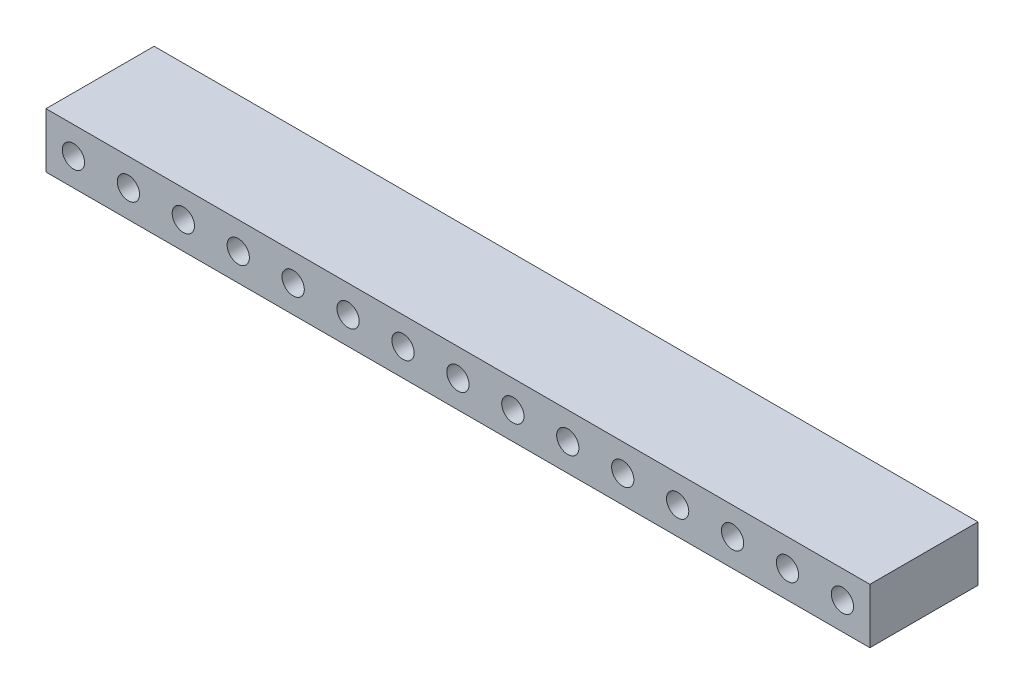
ISO-10303-21;
HEADER;
FILE_DESCRIPTION(('STEP AP214'),'2;1');
FILE_NAME('part.step','',(''),(''),'','','');
FILE_SCHEMA(('AUTOMOTIVE_DESIGN { 1 0 10303 214 1 1 1 1 }'));
ENDSEC;
DATA;
#1=APPLICATION_CONTEXT('core data for automotive mechanical design processes');
#2=APPLICATION_PROTOCOL_DEFINITION('international standard','automotive_design',2000,#1);
#3=PRODUCT_CONTEXT('',#1,'mechanical');
#4=PRODUCT('Part','Part','',(#3));
#5=PRODUCT_RELATED_PRODUCT_CATEGORY('part','',(#4));
#6=PRODUCT_DEFINITION_FORMATION('','',#4);
#7=PRODUCT_DEFINITION_CONTEXT('part definition',#1,'design');
#8=PRODUCT_DEFINITION('design','',#6,#7);
#9=PRODUCT_DEFINITION_SHAPE('','',#8);
#10=(LENGTH_UNIT() NAMED_UNIT(*) SI_UNIT(.MILLI.,.METRE.));
#11=(NAMED_UNIT(*) PLANE_ANGLE_UNIT() SI_UNIT($,.RADIAN.));
#12=(NAMED_UNIT(*) SI_UNIT($,.STERADIAN.) SOLID_ANGLE_UNIT());
#13=UNCERTAINTY_MEASURE_WITH_UNIT(LENGTH_MEASURE(1.E-05),#10,'distance_accuracy_value','');
#14=(GEOMETRIC_REPRESENTATION_CONTEXT(3) GLOBAL_UNCERTAINTY_ASSIGNED_CONTEXT((#13)) GLOBAL_UNIT_ASSIGNED_CONTEXT((#10,
#11,#12)) REPRESENTATION_CONTEXT('',''));
#15=CARTESIAN_POINT('',(0.,0.,0.));
#16=DIRECTION('',(0.,0.,1.));
#17=DIRECTION('',(1.,0.,0.));
#18=AXIS2_PLACEMENT_3D('',#15,#16,#17);
#19=CARTESIAN_POINT('',(0.,0.,5.));
#20=DIRECTION('',(1.,0.,0.));
#21=DIRECTION('',(0.,0.,-1.));
#22=AXIS2_PLACEMENT_3D('',#19,#20,#21);
#23=PLANE('',#22);
#24=DIRECTION('',(0.,-1.,0.));
#25=VECTOR('',#24,1.);
#26=CARTESIAN_POINT('',(0.,0.,0.));
#27=LINE('',#26,#25);
#28=CARTESIAN_POINT('',(0.,2.54,0.));
#29=VERTEX_POINT('',#28);
#30=CARTESIAN_POINT('',(0.,0.,0.));
#31=VERTEX_POINT('',#30);
#32=EDGE_CURVE('E107',#29,#31,#27,.T.);
#33=ORIENTED_EDGE('',*,*,#32,.T.);
#34=DIRECTION('',(0.,0.,-1.));
#35=VECTOR('',#34,1.);
#36=CARTESIAN_POINT('',(0.,0.,5.));
#37=LINE('',#36,#35);
#38=CARTESIAN_POINT('',(0.,0.,5.));
#39=VERTEX_POINT('',#38);
#40=EDGE_CURVE('E11',#39,#31,#37,.T.);
#41=ORIENTED_EDGE('',*,*,#40,.F.);
#42=DIRECTION('',(0.,-1.,0.));
#43=VECTOR('',#42,1.);
#44=CARTESIAN_POINT('',(0.,0.,5.));
#45=LINE('',#44,#43);
#46=CARTESIAN_POINT('',(0.,2.54,5.));
#47=VERTEX_POINT('',#46);
#48=EDGE_CURVE('E91',#47,#39,#45,.T.);
#49=ORIENTED_EDGE('',*,*,#48,.F.);
#50=DIRECTION('',(0.,0.,-1.));
#51=VECTOR('',#50,1.);
#52=CARTESIAN_POINT('',(0.,2.54,5.));
#53=LINE('',#52,#51);
#54=EDGE_CURVE('E103',#47,#29,#53,.T.);
#55=ORIENTED_EDGE('',*,*,#54,.T.);
#56=EDGE_LOOP('',(#33,#41,#49,#55));
#57=FACE_BOUND('',#56,.T.);
#58=ADVANCED_FACE('F39',(#57),#23,.F.);
#59=CARTESIAN_POINT('',(0.,0.,5.));
#60=DIRECTION('',(0.,1.,0.));
#61=DIRECTION('',(0.,0.,1.));
#62=AXIS2_PLACEMENT_3D('',#59,#60,#61);
#63=PLANE('',#62);
#64=DIRECTION('',(1.,0.,0.));
#65=VECTOR('',#64,1.);
#66=CARTESIAN_POINT('',(0.,0.,0.));
#67=LINE('',#66,#65);
#68=CARTESIAN_POINT('',(38.1,0.,0.));
#69=VERTEX_POINT('',#68);
#70=EDGE_CURVE('E96',#31,#69,#67,.T.);
#71=ORIENTED_EDGE('',*,*,#70,.T.);
#72=DIRECTION('',(0.,0.,-1.));
#73=VECTOR('',#72,1.);
#74=CARTESIAN_POINT('',(38.1,0.,5.));
#75=LINE('',#74,#73);
#76=CARTESIAN_POINT('',(38.1,0.,5.));
#77=VERTEX_POINT('',#76);
#78=EDGE_CURVE('E48',#77,#69,#75,.T.);
#79=ORIENTED_EDGE('',*,*,#78,.F.);
#80=DIRECTION('',(1.,0.,0.));
#81=VECTOR('',#80,1.);
#82=CARTESIAN_POINT('',(0.,0.,5.));
#83=LINE('',#82,#81);
#84=EDGE_CURVE('E86',#39,#77,#83,.T.);
#85=ORIENTED_EDGE('',*,*,#84,.F.);
#86=ORIENTED_EDGE('',*,*,#40,.T.);
#87=EDGE_LOOP('',(#71,#79,#85,#86));
#88=FACE_BOUND('',#87,.T.);
#89=ADVANCED_FACE('F95',(#88),#63,.F.);
#90=CARTESIAN_POINT('',(38.1,0.,5.));
#91=DIRECTION('',(-1.,0.,0.));
#92=DIRECTION('',(0.,0.,1.));
#93=AXIS2_PLACEMENT_3D('',#90,#91,#92);
#94=PLANE('',#93);
#95=DIRECTION('',(0.,1.,0.));
#96=VECTOR('',#95,1.);
#97=CARTESIAN_POINT('',(38.1,0.,0.));
#98=LINE('',#97,#96);
#99=CARTESIAN_POINT('',(38.1,2.54,0.));
#100=VERTEX_POINT('',#99);
#101=EDGE_CURVE('E73',#69,#100,#98,.T.);
#102=ORIENTED_EDGE('',*,*,#101,.T.);
#103=DIRECTION('',(0.,0.,-1.));
#104=VECTOR('',#103,1.);
#105=CARTESIAN_POINT('',(38.1,2.54,5.));
#106=LINE('',#105,#104);
#107=CARTESIAN_POINT('',(38.1,2.54,5.));
#108=VERTEX_POINT('',#107);
#109=EDGE_CURVE('E98',#108,#100,#106,.T.);
#110=ORIENTED_EDGE('',*,*,#109,.F.);
#111=DIRECTION('',(0.,1.,0.));
#112=VECTOR('',#111,1.);
#113=CARTESIAN_POINT('',(38.1,0.,5.));
#114=LINE('',#113,#112);
#115=EDGE_CURVE('E89',#77,#108,#114,.T.);
#116=ORIENTED_EDGE('',*,*,#115,.F.);
#117=ORIENTED_EDGE('',*,*,#78,.T.);
#118=EDGE_LOOP('',(#102,#110,#116,#117));
#119=FACE_BOUND('',#118,.T.);
#120=ADVANCED_FACE('F99',(#119),#94,.F.);
#121=CARTESIAN_POINT('',(0.,2.54,5.));
#122=DIRECTION('',(0.,-1.,0.));
#123=DIRECTION('',(0.,0.,-1.));
#124=AXIS2_PLACEMENT_3D('',#121,#122,#123);
#125=PLANE('',#124);
#126=DIRECTION('',(-1.,0.,0.));
#127=VECTOR('',#126,1.);
#128=CARTESIAN_POINT('',(0.,2.54,0.));
#129=LINE('',#128,#127);
#130=EDGE_CURVE('E79',#100,#29,#129,.T.);
#131=ORIENTED_EDGE('',*,*,#130,.T.);
#132=ORIENTED_EDGE('',*,*,#54,.F.);
#133=DIRECTION('',(-1.,0.,0.));
#134=VECTOR('',#133,1.);
#135=CARTESIAN_POINT('',(0.,2.54,5.));
#136=LINE('',#135,#134);
#137=EDGE_CURVE('E56',#108,#47,#136,.T.);
#138=ORIENTED_EDGE('',*,*,#137,.F.);
#139=ORIENTED_EDGE('',*,*,#109,.T.);
#140=EDGE_LOOP('',(#131,#132,#138,#139));
#141=FACE_BOUND('',#140,.T.);
#142=ADVANCED_FACE('F121',(#141),#125,.F.);
#143=CARTESIAN_POINT('',(0.,0.,5.));
#144=DIRECTION('',(0.,0.,-1.));
#145=DIRECTION('',(-1.,0.,0.));
#146=AXIS2_PLACEMENT_3D('',#143,#144,#145);
#147=PLANE('',#146);
#148=CARTESIAN_POINT('',(1.27,1.27,5.));
#149=DIRECTION('',(0.,0.,1.));
#150=DIRECTION('',(1.,0.,0.));
#151=AXIS2_PLACEMENT_3D('',#148,#149,#150);
#152=CIRCLE('',#151,0.51514384170255);
#153=CARTESIAN_POINT('',(1.78514384170255,1.27,5.));
#154=VERTEX_POINT('',#153);
#155=EDGE_CURVE('E240',#154,#154,#152,.T.);
#156=ORIENTED_EDGE('',*,*,#155,.F.);
#157=EDGE_LOOP('',(#156));
#158=FACE_BOUND('',#157,.T.);
#159=CARTESIAN_POINT('',(3.81,1.27,5.));
#160=DIRECTION('',(0.,0.,1.));
#161=DIRECTION('',(1.,0.,0.));
#162=AXIS2_PLACEMENT_3D('',#159,#160,#161);
#163=CIRCLE('',#162,0.515143841702551);
#164=CARTESIAN_POINT('',(4.32514384170255,1.27,5.));
#165=VERTEX_POINT('',#164);
#166=EDGE_CURVE('E232',#165,#165,#163,.T.);
#167=ORIENTED_EDGE('',*,*,#166,.F.);
#168=EDGE_LOOP('',(#167));
#169=FACE_BOUND('',#168,.T.);
#170=CARTESIAN_POINT('',(6.35,1.27,5.));
#171=DIRECTION('',(0.,0.,1.));
#172=DIRECTION('',(1.,0.,0.));
#173=AXIS2_PLACEMENT_3D('',#170,#171,#172);
#174=CIRCLE('',#173,0.51514384170255);
#175=CARTESIAN_POINT('',(6.86514384170255,1.27,5.));
#176=VERTEX_POINT('',#175);
#177=EDGE_CURVE('E224',#176,#176,#174,.T.);
#178=ORIENTED_EDGE('',*,*,#177,.F.);
#179=EDGE_LOOP('',(#178));
#180=FACE_BOUND('',#179,.T.);
#181=CARTESIAN_POINT('',(8.89,1.27,5.));
#182=DIRECTION('',(0.,0.,1.));
#183=DIRECTION('',(1.,0.,0.));
#184=AXIS2_PLACEMENT_3D('',#181,#182,#183);
#185=CIRCLE('',#184,0.51514384170255);
#186=CARTESIAN_POINT('',(9.40514384170255,1.27,5.));
#187=VERTEX_POINT('',#186);
#188=EDGE_CURVE('E216',#187,#187,#185,.T.);
#189=ORIENTED_EDGE('',*,*,#188,.F.);
#190=EDGE_LOOP('',(#189));
#191=FACE_BOUND('',#190,.T.);
#192=CARTESIAN_POINT('',(11.43,1.27,5.));
#193=DIRECTION('',(0.,0.,1.));
#194=DIRECTION('',(1.,0.,0.));
#195=AXIS2_PLACEMENT_3D('',#192,#193,#194);
#196=CIRCLE('',#195,0.51514384170255);
#197=CARTESIAN_POINT('',(11.9451438417025,1.27,5.));
#198=VERTEX_POINT('',#197);
#199=EDGE_CURVE('E208',#198,#198,#196,.T.);
#200=ORIENTED_EDGE('',*,*,#199,.F.);
#201=EDGE_LOOP('',(#200));
#202=FACE_BOUND('',#201,.T.);
#203=CARTESIAN_POINT('',(13.97,1.27,5.));
#204=DIRECTION('',(0.,0.,1.));
#205=DIRECTION('',(1.,0.,0.));
#206=AXIS2_PLACEMENT_3D('',#203,#204,#205);
#207=CIRCLE('',#206,0.51514384170255);
#208=CARTESIAN_POINT('',(14.4851438417026,1.27,5.));
#209=VERTEX_POINT('',#208);
#210=EDGE_CURVE('E200',#209,#209,#207,.T.);
#211=ORIENTED_EDGE('',*,*,#210,.F.);
#212=EDGE_LOOP('',(#211));
#213=FACE_BOUND('',#212,.T.);
#214=CARTESIAN_POINT('',(16.51,1.27,5.));
#215=DIRECTION('',(0.,0.,1.));
#216=DIRECTION('',(1.,0.,0.));
#217=AXIS2_PLACEMENT_3D('',#214,#215,#216);
#218=CIRCLE('',#217,0.51514384170255);
#219=CARTESIAN_POINT('',(17.0251438417026,1.27,5.));
#220=VERTEX_POINT('',#219);
#221=EDGE_CURVE('E192',#220,#220,#218,.T.);
#222=ORIENTED_EDGE('',*,*,#221,.F.);
#223=EDGE_LOOP('',(#222));
#224=FACE_BOUND('',#223,.T.);
#225=CARTESIAN_POINT('',(19.05,1.27,5.));
#226=DIRECTION('',(0.,0.,1.));
#227=DIRECTION('',(1.,0.,0.));
#228=AXIS2_PLACEMENT_3D('',#225,#226,#227);
#229=CIRCLE('',#228,0.51514384170255);
#230=CARTESIAN_POINT('',(19.5651438417026,1.27,5.));
#231=VERTEX_POINT('',#230);
#232=EDGE_CURVE('E184',#231,#231,#229,.T.);
#233=ORIENTED_EDGE('',*,*,#232,.F.);
#234=EDGE_LOOP('',(#233));
#235=FACE_BOUND('',#234,.T.);
#236=CARTESIAN_POINT('',(21.59,1.27,5.));
#237=DIRECTION('',(0.,0.,1.));
#238=DIRECTION('',(1.,0.,0.));
#239=AXIS2_PLACEMENT_3D('',#236,#237,#238);
#240=CIRCLE('',#239,0.51514384170255);
#241=CARTESIAN_POINT('',(22.1051438417026,1.27,5.));
#242=VERTEX_POINT('',#241);
#243=EDGE_CURVE('E176',#242,#242,#240,.T.);
#244=ORIENTED_EDGE('',*,*,#243,.F.);
#245=EDGE_LOOP('',(#244));
#246=FACE_BOUND('',#245,.T.);
#247=CARTESIAN_POINT('',(24.13,1.27,5.));
#248=DIRECTION('',(0.,0.,1.));
#249=DIRECTION('',(1.,0.,0.));
#250=AXIS2_PLACEMENT_3D('',#247,#248,#249);
#251=CIRCLE('',#250,0.51514384170255);
#252=CARTESIAN_POINT('',(24.6451438417026,1.27,5.));
#253=VERTEX_POINT('',#252);
#254=EDGE_CURVE('E168',#253,#253,#251,.T.);
#255=ORIENTED_EDGE('',*,*,#254,.F.);
#256=EDGE_LOOP('',(#255));
#257=FACE_BOUND('',#256,.T.);
#258=CARTESIAN_POINT('',(26.67,1.27,5.));
#259=DIRECTION('',(0.,0.,1.));
#260=DIRECTION('',(1.,0.,0.));
#261=AXIS2_PLACEMENT_3D('',#258,#259,#260);
#262=CIRCLE('',#261,0.51514384170255);
#263=CARTESIAN_POINT('',(27.1851438417026,1.27,5.));
#264=VERTEX_POINT('',#263);
#265=EDGE_CURVE('E160',#264,#264,#262,.T.);
#266=ORIENTED_EDGE('',*,*,#265,.F.);
#267=EDGE_LOOP('',(#266));
#268=FACE_BOUND('',#267,.T.);
#269=CARTESIAN_POINT('',(29.21,1.27,5.));
#270=DIRECTION('',(0.,0.,1.));
#271=DIRECTION('',(1.,0.,0.));
#272=AXIS2_PLACEMENT_3D('',#269,#270,#271);
#273=CIRCLE('',#272,0.51514384170255);
#274=CARTESIAN_POINT('',(29.7251438417026,1.27,5.));
#275=VERTEX_POINT('',#274);
#276=EDGE_CURVE('E152',#275,#275,#273,.T.);
#277=ORIENTED_EDGE('',*,*,#276,.F.);
#278=EDGE_LOOP('',(#277));
#279=FACE_BOUND('',#278,.T.);
#280=CARTESIAN_POINT('',(31.75,1.27,5.));
#281=DIRECTION('',(0.,0.,1.));
#282=DIRECTION('',(1.,0.,0.));
#283=AXIS2_PLACEMENT_3D('',#280,#281,#282);
#284=CIRCLE('',#283,0.515143841702553);
#285=CARTESIAN_POINT('',(32.2651438417026,1.27,5.));
#286=VERTEX_POINT('',#285);
#287=EDGE_CURVE('E144',#286,#286,#284,.T.);
#288=ORIENTED_EDGE('',*,*,#287,.F.);
#289=EDGE_LOOP('',(#288));
#290=FACE_BOUND('',#289,.T.);
#291=CARTESIAN_POINT('',(34.29,1.27,5.));
#292=DIRECTION('',(0.,0.,1.));
#293=DIRECTION('',(1.,0.,0.));
#294=AXIS2_PLACEMENT_3D('',#291,#292,#293);
#295=CIRCLE('',#294,0.515143841702553);
#296=CARTESIAN_POINT('',(34.8051438417026,1.27,5.));
#297=VERTEX_POINT('',#296);
#298=EDGE_CURVE('E136',#297,#297,#295,.T.);
#299=ORIENTED_EDGE('',*,*,#298,.F.);
#300=EDGE_LOOP('',(#299));
#301=FACE_BOUND('',#300,.T.);
#302=CARTESIAN_POINT('',(36.83,1.27,5.));
#303=DIRECTION('',(0.,0.,1.));
#304=DIRECTION('',(1.,0.,0.));
#305=AXIS2_PLACEMENT_3D('',#302,#303,#304);
#306=CIRCLE('',#305,0.515143841702553);
#307=CARTESIAN_POINT('',(37.3451438417026,1.27,5.));
#308=VERTEX_POINT('',#307);
#309=EDGE_CURVE('E128',#308,#308,#306,.T.);
#310=ORIENTED_EDGE('',*,*,#309,.F.);
#311=EDGE_LOOP('',(#310));
#312=FACE_BOUND('',#311,.T.);
#313=ORIENTED_EDGE('',*,*,#48,.T.);
#314=ORIENTED_EDGE('',*,*,#84,.T.);
#315=ORIENTED_EDGE('',*,*,#115,.T.);
#316=ORIENTED_EDGE('',*,*,#137,.T.);
#317=EDGE_LOOP('',(#313,#314,#315,#316));
#318=FACE_BOUND('',#317,.T.);
#319=ADVANCED_FACE('F87',(#158,#169,#180,#191,#202,#213,#224,#235,#246,#257,#268,#279,#290,#301,
#312,#318),#147,.F.);
#320=CARTESIAN_POINT('',(0.,0.,0.));
#321=DIRECTION('',(0.,0.,-1.));
#322=DIRECTION('',(-1.,0.,0.));
#323=AXIS2_PLACEMENT_3D('',#320,#321,#322);
#324=PLANE('',#323);
#325=CARTESIAN_POINT('',(1.27,1.27,0.));
#326=DIRECTION('',(0.,0.,1.));
#327=DIRECTION('',(1.,0.,0.));
#328=AXIS2_PLACEMENT_3D('',#325,#326,#327);
#329=CIRCLE('',#328,0.51514384170255);
#330=CARTESIAN_POINT('',(1.78514384170255,1.27,0.));
#331=VERTEX_POINT('',#330);
#332=EDGE_CURVE('E111',#331,#331,#329,.T.);
#333=ORIENTED_EDGE('',*,*,#332,.T.);
#334=EDGE_LOOP('',(#333));
#335=FACE_BOUND('',#334,.T.);
#336=CARTESIAN_POINT('',(3.81,1.27,0.));
#337=DIRECTION('',(0.,0.,1.));
#338=DIRECTION('',(1.,0.,0.));
#339=AXIS2_PLACEMENT_3D('',#336,#337,#338);
#340=CIRCLE('',#339,0.515143841702551);
#341=CARTESIAN_POINT('',(4.32514384170255,1.27,0.));
#342=VERTEX_POINT('',#341);
#343=EDGE_CURVE('E236',#342,#342,#340,.T.);
#344=ORIENTED_EDGE('',*,*,#343,.T.);
#345=EDGE_LOOP('',(#344));
#346=FACE_BOUND('',#345,.T.);
#347=CARTESIAN_POINT('',(6.35,1.27,0.));
#348=DIRECTION('',(0.,0.,1.));
#349=DIRECTION('',(1.,0.,0.));
#350=AXIS2_PLACEMENT_3D('',#347,#348,#349);
#351=CIRCLE('',#350,0.51514384170255);
#352=CARTESIAN_POINT('',(6.86514384170255,1.27,0.));
#353=VERTEX_POINT('',#352);
#354=EDGE_CURVE('E228',#353,#353,#351,.T.);
#355=ORIENTED_EDGE('',*,*,#354,.T.);
#356=EDGE_LOOP('',(#355));
#357=FACE_BOUND('',#356,.T.);
#358=CARTESIAN_POINT('',(8.89,1.27,0.));
#359=DIRECTION('',(0.,0.,1.));
#360=DIRECTION('',(1.,0.,0.));
#361=AXIS2_PLACEMENT_3D('',#358,#359,#360);
#362=CIRCLE('',#361,0.51514384170255);
#363=CARTESIAN_POINT('',(9.40514384170255,1.27,0.));
#364=VERTEX_POINT('',#363);
#365=EDGE_CURVE('E220',#364,#364,#362,.T.);
#366=ORIENTED_EDGE('',*,*,#365,.T.);
#367=EDGE_LOOP('',(#366));
#368=FACE_BOUND('',#367,.T.);
#369=CARTESIAN_POINT('',(11.43,1.27,0.));
#370=DIRECTION('',(0.,0.,1.));
#371=DIRECTION('',(1.,0.,0.));
#372=AXIS2_PLACEMENT_3D('',#369,#370,#371);
#373=CIRCLE('',#372,0.51514384170255);
#374=CARTESIAN_POINT('',(11.9451438417025,1.27,0.));
#375=VERTEX_POINT('',#374);
#376=EDGE_CURVE('E212',#375,#375,#373,.T.);
#377=ORIENTED_EDGE('',*,*,#376,.T.);
#378=EDGE_LOOP('',(#377));
#379=FACE_BOUND('',#378,.T.);
#380=CARTESIAN_POINT('',(13.97,1.27,0.));
#381=DIRECTION('',(0.,0.,1.));
#382=DIRECTION('',(1.,0.,0.));
#383=AXIS2_PLACEMENT_3D('',#380,#381,#382);
#384=CIRCLE('',#383,0.51514384170255);
#385=CARTESIAN_POINT('',(14.4851438417026,1.27,0.));
#386=VERTEX_POINT('',#385);
#387=EDGE_CURVE('E204',#386,#386,#384,.T.);
#388=ORIENTED_EDGE('',*,*,#387,.T.);
#389=EDGE_LOOP('',(#388));
#390=FACE_BOUND('',#389,.T.);
#391=CARTESIAN_POINT('',(16.51,1.27,0.));
#392=DIRECTION('',(0.,0.,1.));
#393=DIRECTION('',(1.,0.,0.));
#394=AXIS2_PLACEMENT_3D('',#391,#392,#393);
#395=CIRCLE('',#394,0.51514384170255);
#396=CARTESIAN_POINT('',(17.0251438417026,1.27,0.));
#397=VERTEX_POINT('',#396);
#398=EDGE_CURVE('E196',#397,#397,#395,.T.);
#399=ORIENTED_EDGE('',*,*,#398,.T.);
#400=EDGE_LOOP('',(#399));
#401=FACE_BOUND('',#400,.T.);
#402=CARTESIAN_POINT('',(19.05,1.27,0.));
#403=DIRECTION('',(0.,0.,1.));
#404=DIRECTION('',(1.,0.,0.));
#405=AXIS2_PLACEMENT_3D('',#402,#403,#404);
#406=CIRCLE('',#405,0.51514384170255);
#407=CARTESIAN_POINT('',(19.5651438417026,1.27,0.));
#408=VERTEX_POINT('',#407);
#409=EDGE_CURVE('E188',#408,#408,#406,.T.);
#410=ORIENTED_EDGE('',*,*,#409,.T.);
#411=EDGE_LOOP('',(#410));
#412=FACE_BOUND('',#411,.T.);
#413=CARTESIAN_POINT('',(21.59,1.27,0.));
#414=DIRECTION('',(0.,0.,1.));
#415=DIRECTION('',(1.,0.,0.));
#416=AXIS2_PLACEMENT_3D('',#413,#414,#415);
#417=CIRCLE('',#416,0.51514384170255);
#418=CARTESIAN_POINT('',(22.1051438417026,1.27,0.));
#419=VERTEX_POINT('',#418);
#420=EDGE_CURVE('E180',#419,#419,#417,.T.);
#421=ORIENTED_EDGE('',*,*,#420,.T.);
#422=EDGE_LOOP('',(#421));
#423=FACE_BOUND('',#422,.T.);
#424=CARTESIAN_POINT('',(24.13,1.27,0.));
#425=DIRECTION('',(0.,0.,1.));
#426=DIRECTION('',(1.,0.,0.));
#427=AXIS2_PLACEMENT_3D('',#424,#425,#426);
#428=CIRCLE('',#427,0.51514384170255);
#429=CARTESIAN_POINT('',(24.6451438417026,1.27,0.));
#430=VERTEX_POINT('',#429);
#431=EDGE_CURVE('E172',#430,#430,#428,.T.);
#432=ORIENTED_EDGE('',*,*,#431,.T.);
#433=EDGE_LOOP('',(#432));
#434=FACE_BOUND('',#433,.T.);
#435=CARTESIAN_POINT('',(26.67,1.27,0.));
#436=DIRECTION('',(0.,0.,1.));
#437=DIRECTION('',(1.,0.,0.));
#438=AXIS2_PLACEMENT_3D('',#435,#436,#437);
#439=CIRCLE('',#438,0.51514384170255);
#440=CARTESIAN_POINT('',(27.1851438417026,1.27,0.));
#441=VERTEX_POINT('',#440);
#442=EDGE_CURVE('E164',#441,#441,#439,.T.);
#443=ORIENTED_EDGE('',*,*,#442,.T.);
#444=EDGE_LOOP('',(#443));
#445=FACE_BOUND('',#444,.T.);
#446=CARTESIAN_POINT('',(29.21,1.27,0.));
#447=DIRECTION('',(0.,0.,1.));
#448=DIRECTION('',(1.,0.,0.));
#449=AXIS2_PLACEMENT_3D('',#446,#447,#448);
#450=CIRCLE('',#449,0.51514384170255);
#451=CARTESIAN_POINT('',(29.7251438417026,1.27,0.));
#452=VERTEX_POINT('',#451);
#453=EDGE_CURVE('E156',#452,#452,#450,.T.);
#454=ORIENTED_EDGE('',*,*,#453,.T.);
#455=EDGE_LOOP('',(#454));
#456=FACE_BOUND('',#455,.T.);
#457=CARTESIAN_POINT('',(31.75,1.27,0.));
#458=DIRECTION('',(0.,0.,1.));
#459=DIRECTION('',(1.,0.,0.));
#460=AXIS2_PLACEMENT_3D('',#457,#458,#459);
#461=CIRCLE('',#460,0.515143841702553);
#462=CARTESIAN_POINT('',(32.2651438417026,1.27,0.));
#463=VERTEX_POINT('',#462);
#464=EDGE_CURVE('E148',#463,#463,#461,.T.);
#465=ORIENTED_EDGE('',*,*,#464,.T.);
#466=EDGE_LOOP('',(#465));
#467=FACE_BOUND('',#466,.T.);
#468=CARTESIAN_POINT('',(34.29,1.27,0.));
#469=DIRECTION('',(0.,0.,1.));
#470=DIRECTION('',(1.,0.,0.));
#471=AXIS2_PLACEMENT_3D('',#468,#469,#470);
#472=CIRCLE('',#471,0.515143841702553);
#473=CARTESIAN_POINT('',(34.8051438417026,1.27,0.));
#474=VERTEX_POINT('',#473);
#475=EDGE_CURVE('E140',#474,#474,#472,.T.);
#476=ORIENTED_EDGE('',*,*,#475,.T.);
#477=EDGE_LOOP('',(#476));
#478=FACE_BOUND('',#477,.T.);
#479=CARTESIAN_POINT('',(36.83,1.27,0.));
#480=DIRECTION('',(0.,0.,1.));
#481=DIRECTION('',(1.,0.,0.));
#482=AXIS2_PLACEMENT_3D('',#479,#480,#481);
#483=CIRCLE('',#482,0.515143841702553);
#484=CARTESIAN_POINT('',(37.3451438417026,1.27,0.));
#485=VERTEX_POINT('',#484);
#486=EDGE_CURVE('E132',#485,#485,#483,.T.);
#487=ORIENTED_EDGE('',*,*,#486,.T.);
#488=EDGE_LOOP('',(#487));
#489=FACE_BOUND('',#488,.T.);
#490=ORIENTED_EDGE('',*,*,#32,.F.);
#491=ORIENTED_EDGE('',*,*,#130,.F.);
#492=ORIENTED_EDGE('',*,*,#101,.F.);
#493=ORIENTED_EDGE('',*,*,#70,.F.);
#494=EDGE_LOOP('',(#490,#491,#492,#493));
#495=FACE_BOUND('',#494,.T.);
#496=ADVANCED_FACE('F124',(#335,#346,#357,#368,#379,#390,#401,#412,#423,#434,#445,#456,#467,
#478,#489,#495),#324,.T.);
#497=CARTESIAN_POINT('',(36.83,1.27,0.));
#498=DIRECTION('',(0.,0.,1.));
#499=DIRECTION('',(1.,0.,0.));
#500=AXIS2_PLACEMENT_3D('',#497,#498,#499);
#501=CYLINDRICAL_SURFACE('',#500,0.515143841702553);
#502=ORIENTED_EDGE('',*,*,#486,.F.);
#503=EDGE_LOOP('',(#502));
#504=FACE_BOUND('',#503,.T.);
#505=ORIENTED_EDGE('',*,*,#309,.T.);
#506=EDGE_LOOP('',(#505));
#507=FACE_BOUND('',#506,.T.);
#508=ADVANCED_FACE('F288',(#504,#507),#501,.F.);
#509=CARTESIAN_POINT('',(34.29,1.27,0.));
#510=DIRECTION('',(0.,0.,1.));
#511=DIRECTION('',(1.,0.,0.));
#512=AXIS2_PLACEMENT_3D('',#509,#510,#511);
#513=CYLINDRICAL_SURFACE('',#512,0.515143841702553);
#514=ORIENTED_EDGE('',*,*,#475,.F.);
#515=EDGE_LOOP('',(#514));
#516=FACE_BOUND('',#515,.T.);
#517=ORIENTED_EDGE('',*,*,#298,.T.);
#518=EDGE_LOOP('',(#517));
#519=FACE_BOUND('',#518,.T.);
#520=ADVANCED_FACE('F290',(#516,#519),#513,.F.);
#521=CARTESIAN_POINT('',(31.75,1.27,0.));
#522=DIRECTION('',(0.,0.,1.));
#523=DIRECTION('',(1.,0.,0.));
#524=AXIS2_PLACEMENT_3D('',#521,#522,#523);
#525=CYLINDRICAL_SURFACE('',#524,0.515143841702553);
#526=ORIENTED_EDGE('',*,*,#464,.F.);
#527=EDGE_LOOP('',(#526));
#528=FACE_BOUND('',#527,.T.);
#529=ORIENTED_EDGE('',*,*,#287,.T.);
#530=EDGE_LOOP('',(#529));
#531=FACE_BOUND('',#530,.T.);
#532=ADVANCED_FACE('F297',(#528,#531),#525,.F.);
#533=CARTESIAN_POINT('',(29.21,1.27,0.));
#534=DIRECTION('',(0.,0.,1.));
#535=DIRECTION('',(1.,0.,0.));
#536=AXIS2_PLACEMENT_3D('',#533,#534,#535);
#537=CYLINDRICAL_SURFACE('',#536,0.51514384170255);
#538=ORIENTED_EDGE('',*,*,#453,.F.);
#539=EDGE_LOOP('',(#538));
#540=FACE_BOUND('',#539,.T.);
#541=ORIENTED_EDGE('',*,*,#276,.T.);
#542=EDGE_LOOP('',(#541));
#543=FACE_BOUND('',#542,.T.);
#544=ADVANCED_FACE('F343',(#540,#543),#537,.F.);
#545=CARTESIAN_POINT('',(26.67,1.27,0.));
#546=DIRECTION('',(0.,0.,1.));
#547=DIRECTION('',(1.,0.,0.));
#548=AXIS2_PLACEMENT_3D('',#545,#546,#547);
#549=CYLINDRICAL_SURFACE('',#548,0.51514384170255);
#550=ORIENTED_EDGE('',*,*,#442,.F.);
#551=EDGE_LOOP('',(#550));
#552=FACE_BOUND('',#551,.T.);
#553=ORIENTED_EDGE('',*,*,#265,.T.);
#554=EDGE_LOOP('',(#553));
#555=FACE_BOUND('',#554,.T.);
#556=ADVANCED_FACE('F353',(#552,#555),#549,.F.);
#557=CARTESIAN_POINT('',(24.13,1.27,0.));
#558=DIRECTION('',(0.,0.,1.));
#559=DIRECTION('',(1.,0.,0.));
#560=AXIS2_PLACEMENT_3D('',#557,#558,#559);
#561=CYLINDRICAL_SURFACE('',#560,0.51514384170255);
#562=ORIENTED_EDGE('',*,*,#431,.F.);
#563=EDGE_LOOP('',(#562));
#564=FACE_BOUND('',#563,.T.);
#565=ORIENTED_EDGE('',*,*,#254,.T.);
#566=EDGE_LOOP('',(#565));
#567=FACE_BOUND('',#566,.T.);
#568=ADVANCED_FACE('F363',(#564,#567),#561,.F.);
#569=CARTESIAN_POINT('',(21.59,1.27,0.));
#570=DIRECTION('',(0.,0.,1.));
#571=DIRECTION('',(1.,0.,0.));
#572=AXIS2_PLACEMENT_3D('',#569,#570,#571);
#573=CYLINDRICAL_SURFACE('',#572,0.51514384170255);
#574=ORIENTED_EDGE('',*,*,#420,.F.);
#575=EDGE_LOOP('',(#574));
#576=FACE_BOUND('',#575,.T.);
#577=ORIENTED_EDGE('',*,*,#243,.T.);
#578=EDGE_LOOP('',(#577));
#579=FACE_BOUND('',#578,.T.);
#580=ADVANCED_FACE('F373',(#576,#579),#573,.F.);
#581=CARTESIAN_POINT('',(19.05,1.27,0.));
#582=DIRECTION('',(0.,0.,1.));
#583=DIRECTION('',(1.,0.,0.));
#584=AXIS2_PLACEMENT_3D('',#581,#582,#583);
#585=CYLINDRICAL_SURFACE('',#584,0.51514384170255);
#586=ORIENTED_EDGE('',*,*,#409,.F.);
#587=EDGE_LOOP('',(#586));
#588=FACE_BOUND('',#587,.T.);
#589=ORIENTED_EDGE('',*,*,#232,.T.);
#590=EDGE_LOOP('',(#589));
#591=FACE_BOUND('',#590,.T.);
#592=ADVANCED_FACE('F383',(#588,#591),#585,.F.);
#593=CARTESIAN_POINT('',(16.51,1.27,0.));
#594=DIRECTION('',(0.,0.,1.));
#595=DIRECTION('',(1.,0.,0.));
#596=AXIS2_PLACEMENT_3D('',#593,#594,#595);
#597=CYLINDRICAL_SURFACE('',#596,0.51514384170255);
#598=ORIENTED_EDGE('',*,*,#398,.F.);
#599=EDGE_LOOP('',(#598));
#600=FACE_BOUND('',#599,.T.);
#601=ORIENTED_EDGE('',*,*,#221,.T.);
#602=EDGE_LOOP('',(#601));
#603=FACE_BOUND('',#602,.T.);
#604=ADVANCED_FACE('F393',(#600,#603),#597,.F.);
#605=CARTESIAN_POINT('',(13.97,1.27,0.));
#606=DIRECTION('',(0.,0.,1.));
#607=DIRECTION('',(1.,0.,0.));
#608=AXIS2_PLACEMENT_3D('',#605,#606,#607);
#609=CYLINDRICAL_SURFACE('',#608,0.51514384170255);
#610=ORIENTED_EDGE('',*,*,#387,.F.);
#611=EDGE_LOOP('',(#610));
#612=FACE_BOUND('',#611,.T.);
#613=ORIENTED_EDGE('',*,*,#210,.T.);
#614=EDGE_LOOP('',(#613));
#615=FACE_BOUND('',#614,.T.);
#616=ADVANCED_FACE('F403',(#612,#615),#609,.F.);
#617=CARTESIAN_POINT('',(11.43,1.27,0.));
#618=DIRECTION('',(0.,0.,1.));
#619=DIRECTION('',(1.,0.,0.));
#620=AXIS2_PLACEMENT_3D('',#617,#618,#619);
#621=CYLINDRICAL_SURFACE('',#620,0.51514384170255);
#622=ORIENTED_EDGE('',*,*,#376,.F.);
#623=EDGE_LOOP('',(#622));
#624=FACE_BOUND('',#623,.T.);
#625=ORIENTED_EDGE('',*,*,#199,.T.);
#626=EDGE_LOOP('',(#625));
#627=FACE_BOUND('',#626,.T.);
#628=ADVANCED_FACE('F413',(#624,#627),#621,.F.);
#629=CARTESIAN_POINT('',(8.89,1.27,0.));
#630=DIRECTION('',(0.,0.,1.));
#631=DIRECTION('',(1.,0.,0.));
#632=AXIS2_PLACEMENT_3D('',#629,#630,#631);
#633=CYLINDRICAL_SURFACE('',#632,0.51514384170255);
#634=ORIENTED_EDGE('',*,*,#365,.F.);
#635=EDGE_LOOP('',(#634));
#636=FACE_BOUND('',#635,.T.);
#637=ORIENTED_EDGE('',*,*,#188,.T.);
#638=EDGE_LOOP('',(#637));
#639=FACE_BOUND('',#638,.T.);
#640=ADVANCED_FACE('F423',(#636,#639),#633,.F.);
#641=CARTESIAN_POINT('',(6.35,1.27,0.));
#642=DIRECTION('',(0.,0.,1.));
#643=DIRECTION('',(1.,0.,0.));
#644=AXIS2_PLACEMENT_3D('',#641,#642,#643);
#645=CYLINDRICAL_SURFACE('',#644,0.51514384170255);
#646=ORIENTED_EDGE('',*,*,#354,.F.);
#647=EDGE_LOOP('',(#646));
#648=FACE_BOUND('',#647,.T.);
#649=ORIENTED_EDGE('',*,*,#177,.T.);
#650=EDGE_LOOP('',(#649));
#651=FACE_BOUND('',#650,.T.);
#652=ADVANCED_FACE('F433',(#648,#651),#645,.F.);
#653=CARTESIAN_POINT('',(3.81,1.27,0.));
#654=DIRECTION('',(0.,0.,1.));
#655=DIRECTION('',(1.,0.,0.));
#656=AXIS2_PLACEMENT_3D('',#653,#654,#655);
#657=CYLINDRICAL_SURFACE('',#656,0.515143841702551);
#658=ORIENTED_EDGE('',*,*,#343,.F.);
#659=EDGE_LOOP('',(#658));
#660=FACE_BOUND('',#659,.T.);
#661=ORIENTED_EDGE('',*,*,#166,.T.);
#662=EDGE_LOOP('',(#661));
#663=FACE_BOUND('',#662,.T.);
#664=ADVANCED_FACE('F253',(#660,#663),#657,.F.);
#665=CARTESIAN_POINT('',(1.27,1.27,0.));
#666=DIRECTION('',(0.,0.,1.));
#667=DIRECTION('',(1.,0.,0.));
#668=AXIS2_PLACEMENT_3D('',#665,#666,#667);
#669=CYLINDRICAL_SURFACE('',#668,0.51514384170255);
#670=ORIENTED_EDGE('',*,*,#332,.F.);
#671=EDGE_LOOP('',(#670));
#672=FACE_BOUND('',#671,.T.);
#673=ORIENTED_EDGE('',*,*,#155,.T.);
#674=EDGE_LOOP('',(#673));
#675=FACE_BOUND('',#674,.T.);
#676=ADVANCED_FACE('F250',(#672,#675),#669,.F.);
#677=CLOSED_SHELL('',(#58,#89,#120,#142,#319,#496,#508,#520,#532,#544,#556,#568,#580,#592,#604,
#616,#628,#640,#652,#664,#676));
#678=MANIFOLD_SOLID_BREP('B2',#677);
#679=ADVANCED_BREP_SHAPE_REPRESENTATION('',(#18,#678),#14);
#680=SHAPE_DEFINITION_REPRESENTATION(#9,#679);
ENDSEC;
END-ISO-10303-21;
